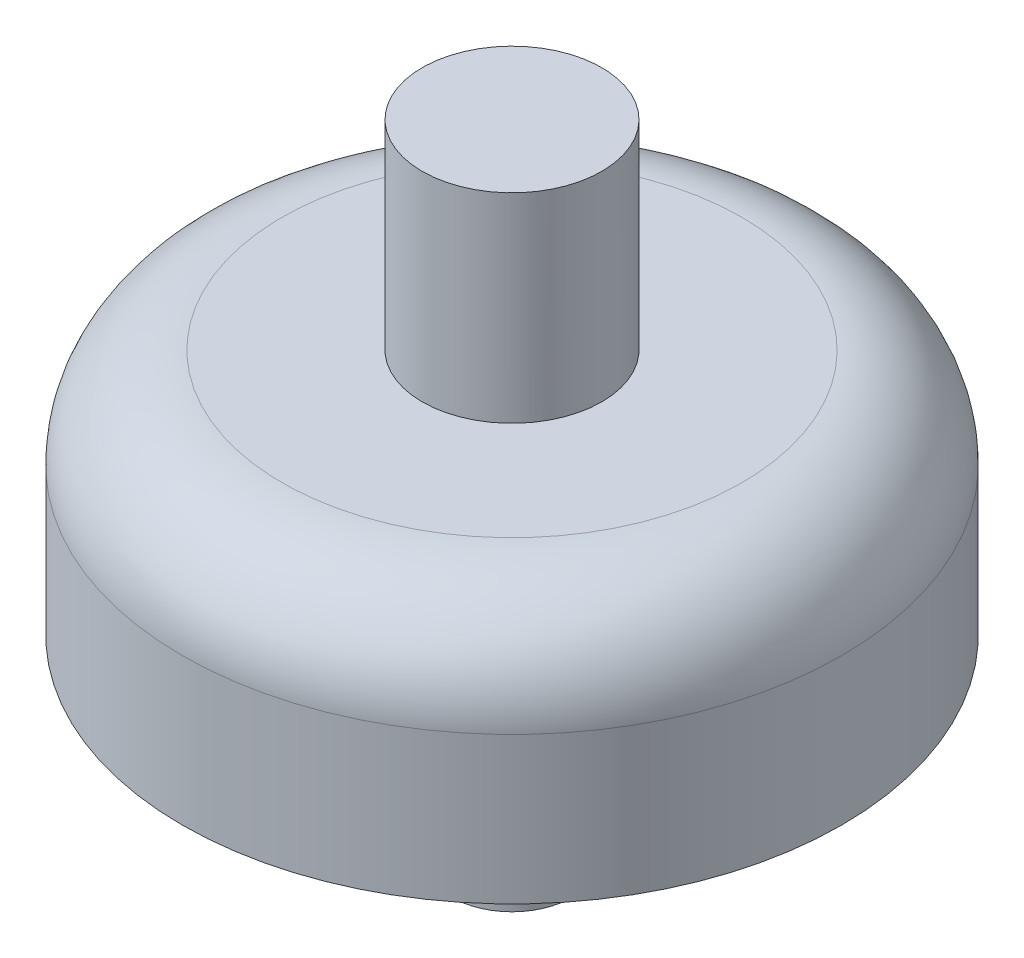
ISO-10303-21;
HEADER;
FILE_DESCRIPTION(('STEP AP214'),'2;1');
FILE_NAME('part.step','',(''),(''),'','','');
FILE_SCHEMA(('AUTOMOTIVE_DESIGN { 1 0 10303 214 1 1 1 1 }'));
ENDSEC;
DATA;
#1=APPLICATION_CONTEXT('core data for automotive mechanical design processes');
#2=APPLICATION_PROTOCOL_DEFINITION('international standard','automotive_design',2000,#1);
#3=PRODUCT_CONTEXT('',#1,'mechanical');
#4=PRODUCT('Part','Part','',(#3));
#5=PRODUCT_RELATED_PRODUCT_CATEGORY('part','',(#4));
#6=PRODUCT_DEFINITION_FORMATION('','',#4);
#7=PRODUCT_DEFINITION_CONTEXT('part definition',#1,'design');
#8=PRODUCT_DEFINITION('design','',#6,#7);
#9=PRODUCT_DEFINITION_SHAPE('','',#8);
#10=(LENGTH_UNIT() NAMED_UNIT(*) SI_UNIT(.MILLI.,.METRE.));
#11=(NAMED_UNIT(*) PLANE_ANGLE_UNIT() SI_UNIT($,.RADIAN.));
#12=(NAMED_UNIT(*) SI_UNIT($,.STERADIAN.) SOLID_ANGLE_UNIT());
#13=UNCERTAINTY_MEASURE_WITH_UNIT(LENGTH_MEASURE(1.E-05),#10,'distance_accuracy_value','');
#14=(GEOMETRIC_REPRESENTATION_CONTEXT(3) GLOBAL_UNCERTAINTY_ASSIGNED_CONTEXT((#13)) GLOBAL_UNIT_ASSIGNED_CONTEXT((#10,
#11,#12)) REPRESENTATION_CONTEXT('',''));
#15=CARTESIAN_POINT('',(0.,0.,0.));
#16=DIRECTION('',(0.,0.,1.));
#17=DIRECTION('',(1.,0.,0.));
#18=AXIS2_PLACEMENT_3D('',#15,#16,#17);
#19=CARTESIAN_POINT('',(-0.826058882265276,-0.285736413141426,0.000128154543364416));
#20=DIRECTION('',(0.,1.,0.));
#21=DIRECTION('',(0.,0.,1.));
#22=AXIS2_PLACEMENT_3D('',#19,#20,#21);
#23=PLANE('',#22);
#24=CARTESIAN_POINT('',(16.5184863998949,-0.285736413141426,0.000128154543364416));
#25=DIRECTION('',(0.,-1.,0.));
#26=DIRECTION('',(0.,0.,-1.));
#27=AXIS2_PLACEMENT_3D('',#24,#25,#26);
#28=CIRCLE('',#27,17.3445452821602);
#29=CARTESIAN_POINT('',(16.5184863998949,-0.285736413141426,-17.3444171276168));
#30=VERTEX_POINT('',#29);
#31=EDGE_CURVE('E154',#30,#30,#28,.T.);
#32=ORIENTED_EDGE('',*,*,#31,.T.);
#33=EDGE_LOOP('',(#32));
#34=FACE_BOUND('',#33,.T.);
#35=CARTESIAN_POINT('',(23.7645078965318,-0.285736413141426,-7.2458933420936));
#36=DIRECTION('',(0.,-1.,0.));
#37=DIRECTION('',(0.,0.,-1.));
#38=AXIS2_PLACEMENT_3D('',#35,#36,#37);
#39=CIRCLE('',#38,3.14999999999999);
#40=CARTESIAN_POINT('',(21.2212443152401,-0.285736413141426,-9.10447085085536));
#41=VERTEX_POINT('',#40);
#42=CARTESIAN_POINT('',(25.6230854052936,-0.285736413141426,-4.70262976080189));
#43=VERTEX_POINT('',#42);
#44=EDGE_CURVE('E134',#41,#43,#39,.T.);
#45=ORIENTED_EDGE('',*,*,#44,.F.);
#46=CARTESIAN_POINT('',(16.5184863998949,-0.285736413141426,0.000128154543364416));
#47=DIRECTION('',(0.,-1.,0.));
#48=DIRECTION('',(0.,0.,-1.));
#49=AXIS2_PLACEMENT_3D('',#46,#47,#48);
#50=CIRCLE('',#49,10.2474218737909);
#51=CARTESIAN_POINT('',(11.8157284845497,-0.285736413141426,-9.10447085085532));
#52=VERTEX_POINT('',#51);
#53=EDGE_CURVE('E131',#52,#41,#50,.T.);
#54=ORIENTED_EDGE('',*,*,#53,.F.);
#55=CARTESIAN_POINT('',(9.27246490325793,-0.285736413141426,-7.24589334209353));
#56=DIRECTION('',(0.,-1.,0.));
#57=DIRECTION('',(0.,0.,-1.));
#58=AXIS2_PLACEMENT_3D('',#55,#56,#57);
#59=CIRCLE('',#58,3.15);
#60=CARTESIAN_POINT('',(7.41388739449616,-0.285736413141426,-4.70262976080178));
#61=VERTEX_POINT('',#60);
#62=EDGE_CURVE('E191',#61,#52,#59,.T.);
#63=ORIENTED_EDGE('',*,*,#62,.F.);
#64=CARTESIAN_POINT('',(16.5184863998949,-0.285736413141426,0.000128154543364416));
#65=DIRECTION('',(0.,-1.,0.));
#66=DIRECTION('',(0.,0.,-1.));
#67=AXIS2_PLACEMENT_3D('',#64,#65,#66);
#68=CIRCLE('',#67,10.2474218737909);
#69=CARTESIAN_POINT('',(7.40191434046452,-0.285736413141426,4.67963335751753));
#70=VERTEX_POINT('',#69);
#71=EDGE_CURVE('E236',#70,#61,#68,.T.);
#72=ORIENTED_EDGE('',*,*,#71,.F.);
#73=CARTESIAN_POINT('',(9.42205566241214,-0.285736413141426,7.09655889202614));
#74=DIRECTION('',(0.,-1.,0.));
#75=DIRECTION('',(0.,0.,-1.));
#76=AXIS2_PLACEMENT_3D('',#73,#74,#75);
#77=CIRCLE('',#76,3.15);
#78=CARTESIAN_POINT('',(11.8389811969208,-0.285736413141426,9.11670021397376));
#79=VERTEX_POINT('',#78);
#80=EDGE_CURVE('E229',#79,#70,#77,.T.);
#81=ORIENTED_EDGE('',*,*,#80,.F.);
#82=CARTESIAN_POINT('',(16.5184863998949,-0.285736413141426,0.000128154543364416));
#83=DIRECTION('',(0.,-1.,0.));
#84=DIRECTION('',(0.,0.,-1.));
#85=AXIS2_PLACEMENT_3D('',#82,#83,#84);
#86=CIRCLE('',#85,10.2474218737909);
#87=CARTESIAN_POINT('',(21.2212443152401,-0.285736413141426,9.10472715994205));
#88=VERTEX_POINT('',#87);
#89=EDGE_CURVE('E221',#88,#79,#86,.T.);
#90=ORIENTED_EDGE('',*,*,#89,.F.);
#91=CARTESIAN_POINT('',(23.7645078965319,-0.285736413141426,7.24614965118026));
#92=DIRECTION('',(0.,-1.,0.));
#93=DIRECTION('',(0.,0.,-1.));
#94=AXIS2_PLACEMENT_3D('',#91,#92,#93);
#95=CIRCLE('',#94,3.15);
#96=CARTESIAN_POINT('',(25.6230854052936,-0.285736413141426,4.70288606988851));
#97=VERTEX_POINT('',#96);
#98=EDGE_CURVE('E66',#97,#88,#95,.T.);
#99=ORIENTED_EDGE('',*,*,#98,.F.);
#100=CARTESIAN_POINT('',(16.5184863998949,-0.285736413141426,0.000128154543364416));
#101=DIRECTION('',(0.,-1.,0.));
#102=DIRECTION('',(0.,0.,-1.));
#103=AXIS2_PLACEMENT_3D('',#100,#101,#102);
#104=CIRCLE('',#103,10.2474218737909);
#105=EDGE_CURVE('E61',#43,#97,#104,.T.);
#106=ORIENTED_EDGE('',*,*,#105,.F.);
#107=EDGE_LOOP('',(#45,#54,#63,#72,#81,#90,#99,#106));
#108=FACE_BOUND('',#107,.T.);
#109=ADVANCED_FACE('F45',(#34,#108),#23,.F.);
#110=CARTESIAN_POINT('',(16.5184863998949,-0.285736413141426,0.000128154543364416));
#111=DIRECTION('',(0.,-1.,0.));
#112=DIRECTION('',(0.,0.,-1.));
#113=AXIS2_PLACEMENT_3D('',#110,#111,#112);
#114=CYLINDRICAL_SURFACE('',#113,17.3445452821602);
#115=CARTESIAN_POINT('',(16.5184863998949,7.43496701525663,0.000128154543364416));
#116=DIRECTION('',(0.,-1.,0.));
#117=DIRECTION('',(0.,0.,-1.));
#118=AXIS2_PLACEMENT_3D('',#115,#116,#117);
#119=CIRCLE('',#118,17.3445452821602);
#120=CARTESIAN_POINT('',(16.5184863998949,7.43496701525663,-17.3444171276168));
#121=VERTEX_POINT('',#120);
#122=EDGE_CURVE('E158',#121,#121,#119,.T.);
#123=ORIENTED_EDGE('',*,*,#122,.T.);
#124=EDGE_LOOP('',(#123));
#125=FACE_BOUND('',#124,.T.);
#126=ORIENTED_EDGE('',*,*,#31,.F.);
#127=EDGE_LOOP('',(#126));
#128=FACE_BOUND('',#127,.T.);
#129=ADVANCED_FACE('F173',(#125,#128),#114,.T.);
#130=CARTESIAN_POINT('',(-0.826058882265276,12.6849670152566,0.000128154543364416));
#131=DIRECTION('',(0.,-1.,0.));
#132=DIRECTION('',(0.,0.,-1.));
#133=AXIS2_PLACEMENT_3D('',#130,#131,#132);
#134=PLANE('',#133);
#135=CARTESIAN_POINT('',(16.5184863998949,12.6849670152566,0.000128154543364416));
#136=DIRECTION('',(0.,-1.,0.));
#137=DIRECTION('',(0.,0.,-1.));
#138=AXIS2_PLACEMENT_3D('',#135,#136,#137);
#139=CIRCLE('',#138,12.0945452821602);
#140=CARTESIAN_POINT('',(16.5184863998949,12.6849670152566,-12.0944171276168));
#141=VERTEX_POINT('',#140);
#142=EDGE_CURVE('E54',#141,#141,#139,.F.);
#143=ORIENTED_EDGE('',*,*,#142,.T.);
#144=EDGE_LOOP('',(#143));
#145=FACE_BOUND('',#144,.T.);
#146=CARTESIAN_POINT('',(16.5184863998949,12.6849670152566,0.000128154543364416));
#147=DIRECTION('',(0.,-1.,0.));
#148=DIRECTION('',(0.,0.,-1.));
#149=AXIS2_PLACEMENT_3D('',#146,#147,#148);
#150=CIRCLE('',#149,4.725);
#151=CARTESIAN_POINT('',(16.5184863998949,12.6849670152566,-4.72487184545664));
#152=VERTEX_POINT('',#151);
#153=EDGE_CURVE('E150',#152,#152,#150,.T.);
#154=ORIENTED_EDGE('',*,*,#153,.T.);
#155=EDGE_LOOP('',(#154));
#156=FACE_BOUND('',#155,.T.);
#157=ADVANCED_FACE('F165',(#145,#156),#134,.F.);
#158=CARTESIAN_POINT('',(16.5184863998949,-6.21503298474336,0.000128154543364416));
#159=DIRECTION('',(0.,1.,0.));
#160=DIRECTION('',(0.,0.,1.));
#161=AXIS2_PLACEMENT_3D('',#158,#159,#160);
#162=CYLINDRICAL_SURFACE('',#161,4.725);
#163=CARTESIAN_POINT('',(16.5184863998949,23.1849670152566,0.000128154543364416));
#164=DIRECTION('',(0.,1.,0.));
#165=DIRECTION('',(0.,0.,1.));
#166=AXIS2_PLACEMENT_3D('',#163,#164,#165);
#167=CIRCLE('',#166,4.725);
#168=CARTESIAN_POINT('',(16.5184863998949,23.1849670152566,4.72512815454337));
#169=VERTEX_POINT('',#168);
#170=EDGE_CURVE('E136',#169,#169,#167,.T.);
#171=ORIENTED_EDGE('',*,*,#170,.F.);
#172=EDGE_LOOP('',(#171));
#173=FACE_BOUND('',#172,.T.);
#174=ORIENTED_EDGE('',*,*,#153,.F.);
#175=EDGE_LOOP('',(#174));
#176=FACE_BOUND('',#175,.T.);
#177=ADVANCED_FACE('F281',(#173,#176),#162,.T.);
#178=CARTESIAN_POINT('',(16.5184863998949,23.1849670152566,0.000128154543364416));
#179=DIRECTION('',(0.,1.,0.));
#180=DIRECTION('',(0.,0.,1.));
#181=AXIS2_PLACEMENT_3D('',#178,#179,#180);
#182=PLANE('',#181);
#183=ORIENTED_EDGE('',*,*,#170,.T.);
#184=EDGE_LOOP('',(#183));
#185=FACE_BOUND('',#184,.T.);
#186=ADVANCED_FACE('F170',(#185),#182,.T.);
#187=CARTESIAN_POINT('',(16.5184863998949,7.43496701525663,0.000128154543364416));
#188=DIRECTION('',(0.,-1.,0.));
#189=DIRECTION('',(0.,0.,-1.));
#190=AXIS2_PLACEMENT_3D('',#187,#188,#189);
#191=TOROIDAL_SURFACE('',#190,12.0945452821602,5.25);
#192=ORIENTED_EDGE('',*,*,#142,.F.);
#193=EDGE_LOOP('',(#192));
#194=FACE_BOUND('',#193,.T.);
#195=ORIENTED_EDGE('',*,*,#122,.F.);
#196=EDGE_LOOP('',(#195));
#197=FACE_BOUND('',#196,.T.);
#198=ADVANCED_FACE('F47',(#194,#197),#191,.T.);
#199=CARTESIAN_POINT('',(23.7645078965318,-3.43573641314143,-7.2458933420936));
#200=DIRECTION('',(0.,1.,0.));
#201=DIRECTION('',(0.,0.,1.));
#202=AXIS2_PLACEMENT_3D('',#199,#200,#201);
#203=CYLINDRICAL_SURFACE('',#202,3.14999999999999);
#204=ORIENTED_EDGE('',*,*,#44,.T.);
#205=DIRECTION('',(0.,1.,0.));
#206=VECTOR('',#205,1.);
#207=CARTESIAN_POINT('',(25.6230854052936,-3.43573641314143,-4.70262976080189));
#208=LINE('',#207,#206);
#209=CARTESIAN_POINT('',(25.6230854052936,-3.43573641314143,-4.70262976080189));
#210=VERTEX_POINT('',#209);
#211=EDGE_CURVE('E112',#210,#43,#208,.T.);
#212=ORIENTED_EDGE('',*,*,#211,.F.);
#213=CARTESIAN_POINT('',(23.7645078965318,-3.43573641314143,-7.2458933420936));
#214=DIRECTION('',(0.,-1.,0.));
#215=DIRECTION('',(0.,0.,-1.));
#216=AXIS2_PLACEMENT_3D('',#213,#214,#215);
#217=CIRCLE('',#216,3.14999999999999);
#218=CARTESIAN_POINT('',(21.2212443152401,-3.43573641314143,-9.10447085085536));
#219=VERTEX_POINT('',#218);
#220=EDGE_CURVE('E120',#219,#210,#217,.T.);
#221=ORIENTED_EDGE('',*,*,#220,.F.);
#222=DIRECTION('',(0.,1.,0.));
#223=VECTOR('',#222,1.);
#224=CARTESIAN_POINT('',(21.2212443152401,-3.43573641314143,-9.10447085085536));
#225=LINE('',#224,#223);
#226=EDGE_CURVE('E187',#219,#41,#225,.T.);
#227=ORIENTED_EDGE('',*,*,#226,.T.);
#228=EDGE_LOOP('',(#204,#212,#221,#227));
#229=FACE_BOUND('',#228,.T.);
#230=ADVANCED_FACE('F133',(#229),#203,.T.);
#231=CARTESIAN_POINT('',(16.5184863998949,-3.43573641314143,0.000128154543364416));
#232=DIRECTION('',(0.,1.,0.));
#233=DIRECTION('',(0.,0.,1.));
#234=AXIS2_PLACEMENT_3D('',#231,#232,#233);
#235=CYLINDRICAL_SURFACE('',#234,10.2474218737909);
#236=ORIENTED_EDGE('',*,*,#105,.T.);
#237=DIRECTION('',(0.,1.,0.));
#238=VECTOR('',#237,1.);
#239=CARTESIAN_POINT('',(25.6230854052936,-3.43573641314143,4.70288606988852));
#240=LINE('',#239,#238);
#241=CARTESIAN_POINT('',(25.6230854052936,-3.43573641314143,4.70288606988852));
#242=VERTEX_POINT('',#241);
#243=EDGE_CURVE('E115',#242,#97,#240,.T.);
#244=ORIENTED_EDGE('',*,*,#243,.F.);
#245=CARTESIAN_POINT('',(16.5184863998949,-3.43573641314143,0.000128154543364416));
#246=DIRECTION('',(0.,-1.,0.));
#247=DIRECTION('',(0.,0.,-1.));
#248=AXIS2_PLACEMENT_3D('',#245,#246,#247);
#249=CIRCLE('',#248,10.2474218737909);
#250=EDGE_CURVE('E108',#210,#242,#249,.T.);
#251=ORIENTED_EDGE('',*,*,#250,.F.);
#252=ORIENTED_EDGE('',*,*,#211,.T.);
#253=EDGE_LOOP('',(#236,#244,#251,#252));
#254=FACE_BOUND('',#253,.T.);
#255=ADVANCED_FACE('F110',(#254),#235,.T.);
#256=CARTESIAN_POINT('',(23.7645078965319,-3.43573641314143,7.24614965118026));
#257=DIRECTION('',(0.,1.,0.));
#258=DIRECTION('',(0.,0.,1.));
#259=AXIS2_PLACEMENT_3D('',#256,#257,#258);
#260=CYLINDRICAL_SURFACE('',#259,3.15);
#261=ORIENTED_EDGE('',*,*,#98,.T.);
#262=DIRECTION('',(0.,1.,0.));
#263=VECTOR('',#262,1.);
#264=CARTESIAN_POINT('',(21.2212443152401,-3.43573641314143,9.10472715994205));
#265=LINE('',#264,#263);
#266=CARTESIAN_POINT('',(21.2212443152401,-3.43573641314143,9.10472715994205));
#267=VERTEX_POINT('',#266);
#268=EDGE_CURVE('E143',#267,#88,#265,.T.);
#269=ORIENTED_EDGE('',*,*,#268,.F.);
#270=CARTESIAN_POINT('',(23.7645078965319,-3.43573641314143,7.24614965118026));
#271=DIRECTION('',(0.,-1.,0.));
#272=DIRECTION('',(0.,0.,-1.));
#273=AXIS2_PLACEMENT_3D('',#270,#271,#272);
#274=CIRCLE('',#273,3.15);
#275=EDGE_CURVE('E119',#242,#267,#274,.T.);
#276=ORIENTED_EDGE('',*,*,#275,.F.);
#277=ORIENTED_EDGE('',*,*,#243,.T.);
#278=EDGE_LOOP('',(#261,#269,#276,#277));
#279=FACE_BOUND('',#278,.T.);
#280=ADVANCED_FACE('F224',(#279),#260,.T.);
#281=CARTESIAN_POINT('',(16.5184863998949,-3.43573641314143,0.000128154543364416));
#282=DIRECTION('',(0.,1.,0.));
#283=DIRECTION('',(0.,0.,1.));
#284=AXIS2_PLACEMENT_3D('',#281,#282,#283);
#285=CYLINDRICAL_SURFACE('',#284,10.2474218737909);
#286=ORIENTED_EDGE('',*,*,#89,.T.);
#287=DIRECTION('',(0.,1.,0.));
#288=VECTOR('',#287,1.);
#289=CARTESIAN_POINT('',(11.8389811969208,-3.43573641314143,9.11670021397376));
#290=LINE('',#289,#288);
#291=CARTESIAN_POINT('',(11.8389811969208,-3.43573641314143,9.11670021397376));
#292=VERTEX_POINT('',#291);
#293=EDGE_CURVE('E210',#292,#79,#290,.T.);
#294=ORIENTED_EDGE('',*,*,#293,.F.);
#295=CARTESIAN_POINT('',(16.5184863998949,-3.43573641314143,0.000128154543364416));
#296=DIRECTION('',(0.,-1.,0.));
#297=DIRECTION('',(0.,0.,-1.));
#298=AXIS2_PLACEMENT_3D('',#295,#296,#297);
#299=CIRCLE('',#298,10.2474218737909);
#300=EDGE_CURVE('E222',#267,#292,#299,.T.);
#301=ORIENTED_EDGE('',*,*,#300,.F.);
#302=ORIENTED_EDGE('',*,*,#268,.T.);
#303=EDGE_LOOP('',(#286,#294,#301,#302));
#304=FACE_BOUND('',#303,.T.);
#305=ADVANCED_FACE('F219',(#304),#285,.T.);
#306=CARTESIAN_POINT('',(9.42205566241214,-3.43573641314143,7.09655889202614));
#307=DIRECTION('',(0.,1.,0.));
#308=DIRECTION('',(0.,0.,1.));
#309=AXIS2_PLACEMENT_3D('',#306,#307,#308);
#310=CYLINDRICAL_SURFACE('',#309,3.15);
#311=ORIENTED_EDGE('',*,*,#80,.T.);
#312=DIRECTION('',(0.,1.,0.));
#313=VECTOR('',#312,1.);
#314=CARTESIAN_POINT('',(7.40191434046452,-3.43573641314143,4.67963335751753));
#315=LINE('',#314,#313);
#316=CARTESIAN_POINT('',(7.40191434046452,-3.43573641314143,4.67963335751753));
#317=VERTEX_POINT('',#316);
#318=EDGE_CURVE('E206',#317,#70,#315,.T.);
#319=ORIENTED_EDGE('',*,*,#318,.F.);
#320=CARTESIAN_POINT('',(9.42205566241214,-3.43573641314143,7.09655889202614));
#321=DIRECTION('',(0.,-1.,0.));
#322=DIRECTION('',(0.,0.,-1.));
#323=AXIS2_PLACEMENT_3D('',#320,#321,#322);
#324=CIRCLE('',#323,3.15);
#325=EDGE_CURVE('E252',#292,#317,#324,.T.);
#326=ORIENTED_EDGE('',*,*,#325,.F.);
#327=ORIENTED_EDGE('',*,*,#293,.T.);
#328=EDGE_LOOP('',(#311,#319,#326,#327));
#329=FACE_BOUND('',#328,.T.);
#330=ADVANCED_FACE('F251',(#329),#310,.T.);
#331=CARTESIAN_POINT('',(16.5184863998949,-3.43573641314143,0.000128154543364416));
#332=DIRECTION('',(0.,1.,0.));
#333=DIRECTION('',(0.,0.,1.));
#334=AXIS2_PLACEMENT_3D('',#331,#332,#333);
#335=CYLINDRICAL_SURFACE('',#334,10.2474218737909);
#336=ORIENTED_EDGE('',*,*,#71,.T.);
#337=DIRECTION('',(0.,1.,0.));
#338=VECTOR('',#337,1.);
#339=CARTESIAN_POINT('',(7.41388739449617,-3.43573641314143,-4.70262976080179));
#340=LINE('',#339,#338);
#341=CARTESIAN_POINT('',(7.41388739449617,-3.43573641314143,-4.70262976080179));
#342=VERTEX_POINT('',#341);
#343=EDGE_CURVE('E197',#342,#61,#340,.T.);
#344=ORIENTED_EDGE('',*,*,#343,.F.);
#345=CARTESIAN_POINT('',(16.5184863998949,-3.43573641314143,0.000128154543364416));
#346=DIRECTION('',(0.,-1.,0.));
#347=DIRECTION('',(0.,0.,-1.));
#348=AXIS2_PLACEMENT_3D('',#345,#346,#347);
#349=CIRCLE('',#348,10.2474218737909);
#350=EDGE_CURVE('E248',#317,#342,#349,.T.);
#351=ORIENTED_EDGE('',*,*,#350,.F.);
#352=ORIENTED_EDGE('',*,*,#318,.T.);
#353=EDGE_LOOP('',(#336,#344,#351,#352));
#354=FACE_BOUND('',#353,.T.);
#355=ADVANCED_FACE('F245',(#354),#335,.T.);
#356=CARTESIAN_POINT('',(9.27246490325793,-3.43573641314143,-7.24589334209353));
#357=DIRECTION('',(0.,1.,0.));
#358=DIRECTION('',(0.,0.,1.));
#359=AXIS2_PLACEMENT_3D('',#356,#357,#358);
#360=CYLINDRICAL_SURFACE('',#359,3.15);
#361=ORIENTED_EDGE('',*,*,#62,.T.);
#362=DIRECTION('',(0.,1.,0.));
#363=VECTOR('',#362,1.);
#364=CARTESIAN_POINT('',(11.8157284845497,-3.43573641314143,-9.10447085085532));
#365=LINE('',#364,#363);
#366=CARTESIAN_POINT('',(11.8157284845497,-3.43573641314143,-9.10447085085532));
#367=VERTEX_POINT('',#366);
#368=EDGE_CURVE('E189',#367,#52,#365,.T.);
#369=ORIENTED_EDGE('',*,*,#368,.F.);
#370=CARTESIAN_POINT('',(9.27246490325793,-3.43573641314143,-7.24589334209353));
#371=DIRECTION('',(0.,-1.,0.));
#372=DIRECTION('',(0.,0.,-1.));
#373=AXIS2_PLACEMENT_3D('',#370,#371,#372);
#374=CIRCLE('',#373,3.15);
#375=EDGE_CURVE('E199',#342,#367,#374,.T.);
#376=ORIENTED_EDGE('',*,*,#375,.F.);
#377=ORIENTED_EDGE('',*,*,#343,.T.);
#378=EDGE_LOOP('',(#361,#369,#376,#377));
#379=FACE_BOUND('',#378,.T.);
#380=ADVANCED_FACE('F241',(#379),#360,.T.);
#381=CARTESIAN_POINT('',(16.5184863998949,-3.43573641314143,0.000128154543364416));
#382=DIRECTION('',(0.,1.,0.));
#383=DIRECTION('',(0.,0.,1.));
#384=AXIS2_PLACEMENT_3D('',#381,#382,#383);
#385=CYLINDRICAL_SURFACE('',#384,10.2474218737909);
#386=ORIENTED_EDGE('',*,*,#53,.T.);
#387=ORIENTED_EDGE('',*,*,#226,.F.);
#388=CARTESIAN_POINT('',(16.5184863998949,-3.43573641314143,0.000128154543364416));
#389=DIRECTION('',(0.,-1.,0.));
#390=DIRECTION('',(0.,0.,-1.));
#391=AXIS2_PLACEMENT_3D('',#388,#389,#390);
#392=CIRCLE('',#391,10.2474218737909);
#393=EDGE_CURVE('E126',#367,#219,#392,.T.);
#394=ORIENTED_EDGE('',*,*,#393,.F.);
#395=ORIENTED_EDGE('',*,*,#368,.T.);
#396=EDGE_LOOP('',(#386,#387,#394,#395));
#397=FACE_BOUND('',#396,.T.);
#398=ADVANCED_FACE('F186',(#397),#385,.T.);
#399=CARTESIAN_POINT('',(-0.826058882265276,-3.43573641314143,0.000128154543364416));
#400=DIRECTION('',(0.,-1.,0.));
#401=DIRECTION('',(0.,0.,-1.));
#402=AXIS2_PLACEMENT_3D('',#399,#400,#401);
#403=PLANE('',#402);
#404=ORIENTED_EDGE('',*,*,#220,.T.);
#405=ORIENTED_EDGE('',*,*,#250,.T.);
#406=ORIENTED_EDGE('',*,*,#275,.T.);
#407=ORIENTED_EDGE('',*,*,#300,.T.);
#408=ORIENTED_EDGE('',*,*,#325,.T.);
#409=ORIENTED_EDGE('',*,*,#350,.T.);
#410=ORIENTED_EDGE('',*,*,#375,.T.);
#411=ORIENTED_EDGE('',*,*,#393,.T.);
#412=EDGE_LOOP('',(#404,#405,#406,#407,#408,#409,#410,#411));
#413=FACE_BOUND('',#412,.T.);
#414=CARTESIAN_POINT('',(16.5184863998949,-3.43573641314143,0.000128154543364416));
#415=DIRECTION('',(0.,-1.,0.));
#416=DIRECTION('',(0.,0.,-1.));
#417=AXIS2_PLACEMENT_3D('',#414,#415,#416);
#418=CIRCLE('',#417,4.725);
#419=CARTESIAN_POINT('',(16.5184863998949,-3.43573641314143,-4.72487184545664));
#420=VERTEX_POINT('',#419);
#421=EDGE_CURVE('E11',#420,#420,#418,.F.);
#422=ORIENTED_EDGE('',*,*,#421,.T.);
#423=EDGE_LOOP('',(#422));
#424=FACE_BOUND('',#423,.T.);
#425=ADVANCED_FACE('F123',(#413,#424),#403,.T.);
#426=CARTESIAN_POINT('',(16.5184863998949,-6.21503298474336,0.000128154543364416));
#427=DIRECTION('',(0.,1.,0.));
#428=DIRECTION('',(0.,0.,1.));
#429=AXIS2_PLACEMENT_3D('',#426,#427,#428);
#430=PLANE('',#429);
#431=CARTESIAN_POINT('',(16.5184863998949,-6.21503298474336,0.000128154543364416));
#432=DIRECTION('',(0.,1.,0.));
#433=DIRECTION('',(0.,0.,1.));
#434=AXIS2_PLACEMENT_3D('',#431,#432,#433);
#435=CIRCLE('',#434,4.725);
#436=CARTESIAN_POINT('',(16.5184863998949,-6.21503298474336,4.72512815454337));
#437=VERTEX_POINT('',#436);
#438=EDGE_CURVE('E141',#437,#437,#435,.T.);
#439=ORIENTED_EDGE('',*,*,#438,.F.);
#440=EDGE_LOOP('',(#439));
#441=FACE_BOUND('',#440,.T.);
#442=ADVANCED_FACE('F283',(#441),#430,.F.);
#443=ORIENTED_EDGE('',*,*,#421,.F.);
#444=EDGE_LOOP('',(#443));
#445=FACE_BOUND('',#444,.T.);
#446=ORIENTED_EDGE('',*,*,#438,.T.);
#447=EDGE_LOOP('',(#446));
#448=FACE_BOUND('',#447,.T.);
#449=ADVANCED_FACE('F286',(#445,#448),#162,.T.);
#450=CLOSED_SHELL('',(#109,#129,#157,#177,#186,#198,#230,#255,#280,#305,#330,#355,#380,#398,
#425,#442,#449));
#451=MANIFOLD_SOLID_BREP('B2',#450);
#452=ADVANCED_BREP_SHAPE_REPRESENTATION('',(#18,#451),#14);
#453=SHAPE_DEFINITION_REPRESENTATION(#9,#452);
ENDSEC;
END-ISO-10303-21;
